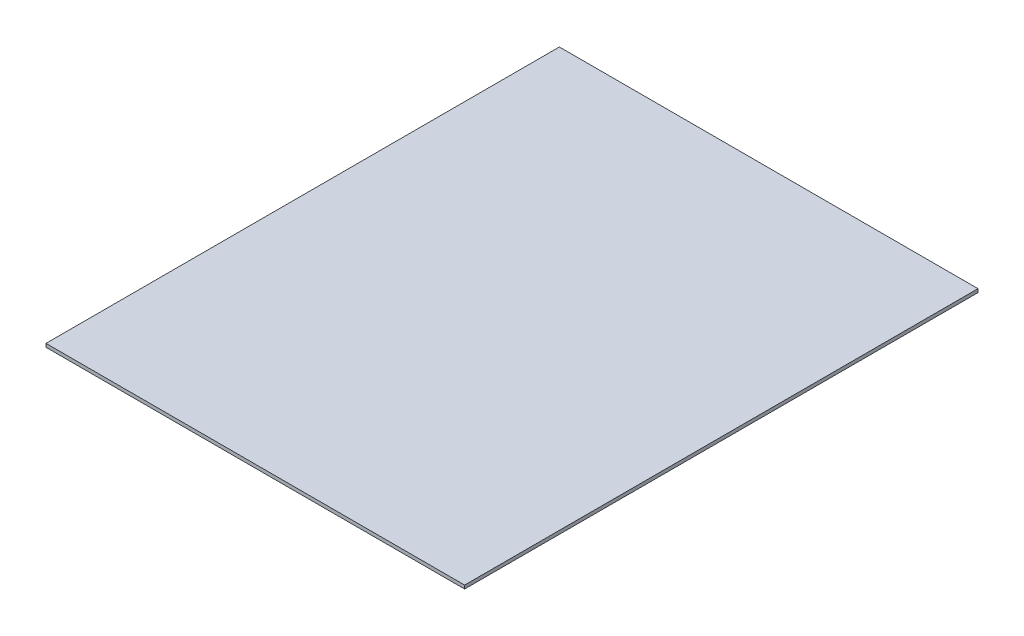
ISO-10303-21;
HEADER;
FILE_DESCRIPTION(('STEP AP214'),'2;1');
FILE_NAME('part.step','',(''),(''),'','','');
FILE_SCHEMA(('AUTOMOTIVE_DESIGN { 1 0 10303 214 1 1 1 1 }'));
ENDSEC;
DATA;
#1=APPLICATION_CONTEXT('core data for automotive mechanical design processes');
#2=APPLICATION_PROTOCOL_DEFINITION('international standard','automotive_design',2000,#1);
#3=PRODUCT_CONTEXT('',#1,'mechanical');
#4=PRODUCT('Part','Part','',(#3));
#5=PRODUCT_RELATED_PRODUCT_CATEGORY('part','',(#4));
#6=PRODUCT_DEFINITION_FORMATION('','',#4);
#7=PRODUCT_DEFINITION_CONTEXT('part definition',#1,'design');
#8=PRODUCT_DEFINITION('design','',#6,#7);
#9=PRODUCT_DEFINITION_SHAPE('','',#8);
#10=(LENGTH_UNIT() NAMED_UNIT(*) SI_UNIT(.MILLI.,.METRE.));
#11=(NAMED_UNIT(*) PLANE_ANGLE_UNIT() SI_UNIT($,.RADIAN.));
#12=(NAMED_UNIT(*) SI_UNIT($,.STERADIAN.) SOLID_ANGLE_UNIT());
#13=UNCERTAINTY_MEASURE_WITH_UNIT(LENGTH_MEASURE(1.E-05),#10,'distance_accuracy_value','');
#14=(GEOMETRIC_REPRESENTATION_CONTEXT(3) GLOBAL_UNCERTAINTY_ASSIGNED_CONTEXT((#13)) GLOBAL_UNIT_ASSIGNED_CONTEXT((#10,
#11,#12)) REPRESENTATION_CONTEXT('',''));
#15=CARTESIAN_POINT('',(0.,0.,0.));
#16=DIRECTION('',(0.,0.,1.));
#17=DIRECTION('',(1.,0.,0.));
#18=AXIS2_PLACEMENT_3D('',#15,#16,#17);
#19=CARTESIAN_POINT('',(3037.5,50.,3725.));
#20=DIRECTION('',(-1.,0.,0.));
#21=DIRECTION('',(0.,0.,1.));
#22=AXIS2_PLACEMENT_3D('',#19,#20,#21);
#23=PLANE('',#22);
#24=DIRECTION('',(0.,0.,-1.));
#25=VECTOR('',#24,1.);
#26=CARTESIAN_POINT('',(3037.5,0.,3725.));
#27=LINE('',#26,#25);
#28=CARTESIAN_POINT('',(3037.5,0.,3725.));
#29=VERTEX_POINT('',#28);
#30=CARTESIAN_POINT('',(3037.5,0.,-3725.));
#31=VERTEX_POINT('',#30);
#32=EDGE_CURVE('E102',#29,#31,#27,.T.);
#33=ORIENTED_EDGE('',*,*,#32,.T.);
#34=DIRECTION('',(0.,-1.,0.));
#35=VECTOR('',#34,1.);
#36=CARTESIAN_POINT('',(3037.5,50.,-3725.));
#37=LINE('',#36,#35);
#38=CARTESIAN_POINT('',(3037.5,50.,-3725.));
#39=VERTEX_POINT('',#38);
#40=EDGE_CURVE('E11',#39,#31,#37,.T.);
#41=ORIENTED_EDGE('',*,*,#40,.F.);
#42=DIRECTION('',(0.,0.,-1.));
#43=VECTOR('',#42,1.);
#44=CARTESIAN_POINT('',(3037.5,50.,3725.));
#45=LINE('',#44,#43);
#46=CARTESIAN_POINT('',(3037.5,50.,3725.));
#47=VERTEX_POINT('',#46);
#48=EDGE_CURVE('E95',#47,#39,#45,.T.);
#49=ORIENTED_EDGE('',*,*,#48,.F.);
#50=DIRECTION('',(0.,-1.,0.));
#51=VECTOR('',#50,1.);
#52=CARTESIAN_POINT('',(3037.5,50.,3725.));
#53=LINE('',#52,#51);
#54=EDGE_CURVE('E99',#47,#29,#53,.T.);
#55=ORIENTED_EDGE('',*,*,#54,.T.);
#56=EDGE_LOOP('',(#33,#41,#49,#55));
#57=FACE_BOUND('',#56,.T.);
#58=ADVANCED_FACE('F41',(#57),#23,.F.);
#59=CARTESIAN_POINT('',(-3037.5,50.,-3725.));
#60=DIRECTION('',(0.,0.,1.));
#61=DIRECTION('',(1.,0.,0.));
#62=AXIS2_PLACEMENT_3D('',#59,#60,#61);
#63=PLANE('',#62);
#64=DIRECTION('',(-1.,0.,0.));
#65=VECTOR('',#64,1.);
#66=CARTESIAN_POINT('',(-3037.5,0.,-3725.));
#67=LINE('',#66,#65);
#68=CARTESIAN_POINT('',(-3037.5,0.,-3725.));
#69=VERTEX_POINT('',#68);
#70=EDGE_CURVE('E96',#31,#69,#67,.T.);
#71=ORIENTED_EDGE('',*,*,#70,.T.);
#72=DIRECTION('',(0.,-1.,0.));
#73=VECTOR('',#72,1.);
#74=CARTESIAN_POINT('',(-3037.5,50.,-3725.));
#75=LINE('',#74,#73);
#76=CARTESIAN_POINT('',(-3037.5,50.,-3725.));
#77=VERTEX_POINT('',#76);
#78=EDGE_CURVE('E47',#77,#69,#75,.T.);
#79=ORIENTED_EDGE('',*,*,#78,.F.);
#80=DIRECTION('',(-1.,0.,0.));
#81=VECTOR('',#80,1.);
#82=CARTESIAN_POINT('',(-3037.5,50.,-3725.));
#83=LINE('',#82,#81);
#84=EDGE_CURVE('E87',#39,#77,#83,.T.);
#85=ORIENTED_EDGE('',*,*,#84,.F.);
#86=ORIENTED_EDGE('',*,*,#40,.T.);
#87=EDGE_LOOP('',(#71,#79,#85,#86));
#88=FACE_BOUND('',#87,.T.);
#89=ADVANCED_FACE('F92',(#88),#63,.F.);
#90=CARTESIAN_POINT('',(-3037.5,50.,3725.));
#91=DIRECTION('',(1.,0.,0.));
#92=DIRECTION('',(0.,0.,-1.));
#93=AXIS2_PLACEMENT_3D('',#90,#91,#92);
#94=PLANE('',#93);
#95=DIRECTION('',(0.,0.,1.));
#96=VECTOR('',#95,1.);
#97=CARTESIAN_POINT('',(-3037.5,0.,3725.));
#98=LINE('',#97,#96);
#99=CARTESIAN_POINT('',(-3037.5,0.,3725.));
#100=VERTEX_POINT('',#99);
#101=EDGE_CURVE('E74',#69,#100,#98,.T.);
#102=ORIENTED_EDGE('',*,*,#101,.T.);
#103=DIRECTION('',(0.,-1.,0.));
#104=VECTOR('',#103,1.);
#105=CARTESIAN_POINT('',(-3037.5,50.,3725.));
#106=LINE('',#105,#104);
#107=CARTESIAN_POINT('',(-3037.5,50.,3725.));
#108=VERTEX_POINT('',#107);
#109=EDGE_CURVE('E100',#108,#100,#106,.T.);
#110=ORIENTED_EDGE('',*,*,#109,.F.);
#111=DIRECTION('',(0.,0.,1.));
#112=VECTOR('',#111,1.);
#113=CARTESIAN_POINT('',(-3037.5,50.,3725.));
#114=LINE('',#113,#112);
#115=EDGE_CURVE('E89',#77,#108,#114,.T.);
#116=ORIENTED_EDGE('',*,*,#115,.F.);
#117=ORIENTED_EDGE('',*,*,#78,.T.);
#118=EDGE_LOOP('',(#102,#110,#116,#117));
#119=FACE_BOUND('',#118,.T.);
#120=ADVANCED_FACE('F98',(#119),#94,.F.);
#121=CARTESIAN_POINT('',(-3037.5,50.,3725.));
#122=DIRECTION('',(0.,0.,-1.));
#123=DIRECTION('',(-1.,0.,0.));
#124=AXIS2_PLACEMENT_3D('',#121,#122,#123);
#125=PLANE('',#124);
#126=DIRECTION('',(1.,0.,0.));
#127=VECTOR('',#126,1.);
#128=CARTESIAN_POINT('',(-3037.5,0.,3725.));
#129=LINE('',#128,#127);
#130=EDGE_CURVE('E79',#100,#29,#129,.T.);
#131=ORIENTED_EDGE('',*,*,#130,.T.);
#132=ORIENTED_EDGE('',*,*,#54,.F.);
#133=DIRECTION('',(1.,0.,0.));
#134=VECTOR('',#133,1.);
#135=CARTESIAN_POINT('',(-3037.5,50.,3725.));
#136=LINE('',#135,#134);
#137=EDGE_CURVE('E60',#108,#47,#136,.T.);
#138=ORIENTED_EDGE('',*,*,#137,.F.);
#139=ORIENTED_EDGE('',*,*,#109,.T.);
#140=EDGE_LOOP('',(#131,#132,#138,#139));
#141=FACE_BOUND('',#140,.T.);
#142=ADVANCED_FACE('F112',(#141),#125,.F.);
#143=CARTESIAN_POINT('',(0.,50.,0.));
#144=DIRECTION('',(0.,-1.,0.));
#145=DIRECTION('',(0.,0.,-1.));
#146=AXIS2_PLACEMENT_3D('',#143,#144,#145);
#147=PLANE('',#146);
#148=ORIENTED_EDGE('',*,*,#48,.T.);
#149=ORIENTED_EDGE('',*,*,#84,.T.);
#150=ORIENTED_EDGE('',*,*,#115,.T.);
#151=ORIENTED_EDGE('',*,*,#137,.T.);
#152=EDGE_LOOP('',(#148,#149,#150,#151));
#153=FACE_BOUND('',#152,.T.);
#154=ADVANCED_FACE('F86',(#153),#147,.F.);
#155=CARTESIAN_POINT('',(0.,0.,0.));
#156=DIRECTION('',(0.,-1.,0.));
#157=DIRECTION('',(0.,0.,-1.));
#158=AXIS2_PLACEMENT_3D('',#155,#156,#157);
#159=PLANE('',#158);
#160=ORIENTED_EDGE('',*,*,#32,.F.);
#161=ORIENTED_EDGE('',*,*,#130,.F.);
#162=ORIENTED_EDGE('',*,*,#101,.F.);
#163=ORIENTED_EDGE('',*,*,#70,.F.);
#164=EDGE_LOOP('',(#160,#161,#162,#163));
#165=FACE_BOUND('',#164,.T.);
#166=ADVANCED_FACE('F111',(#165),#159,.T.);
#167=CLOSED_SHELL('',(#58,#89,#120,#142,#154,#166));
#168=MANIFOLD_SOLID_BREP('B2',#167);
#169=ADVANCED_BREP_SHAPE_REPRESENTATION('',(#18,#168),#14);
#170=SHAPE_DEFINITION_REPRESENTATION(#9,#169);
ENDSEC;
END-ISO-10303-21;
